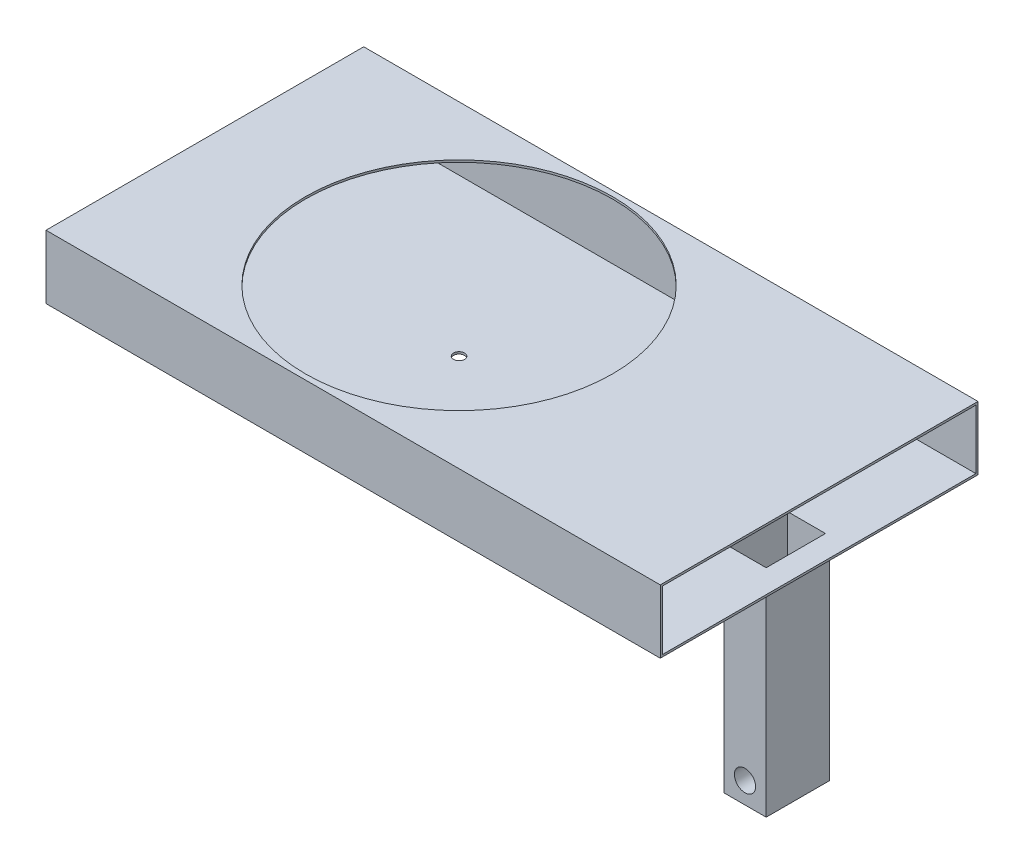
ISO-10303-21;
HEADER;
FILE_DESCRIPTION(('STEP AP214'),'2;1');
FILE_NAME('part.step','',(''),(''),'','','');
FILE_SCHEMA(('AUTOMOTIVE_DESIGN { 1 0 10303 214 1 1 1 1 }'));
ENDSEC;
DATA;
#1=APPLICATION_CONTEXT('core data for automotive mechanical design processes');
#2=APPLICATION_PROTOCOL_DEFINITION('international standard','automotive_design',2000,#1);
#3=PRODUCT_CONTEXT('',#1,'mechanical');
#4=PRODUCT('Part','Part','',(#3));
#5=PRODUCT_RELATED_PRODUCT_CATEGORY('part','',(#4));
#6=PRODUCT_DEFINITION_FORMATION('','',#4);
#7=PRODUCT_DEFINITION_CONTEXT('part definition',#1,'design');
#8=PRODUCT_DEFINITION('design','',#6,#7);
#9=PRODUCT_DEFINITION_SHAPE('','',#8);
#10=(LENGTH_UNIT() NAMED_UNIT(*) SI_UNIT(.MILLI.,.METRE.));
#11=(NAMED_UNIT(*) PLANE_ANGLE_UNIT() SI_UNIT($,.RADIAN.));
#12=(NAMED_UNIT(*) SI_UNIT($,.STERADIAN.) SOLID_ANGLE_UNIT());
#13=UNCERTAINTY_MEASURE_WITH_UNIT(LENGTH_MEASURE(1.E-05),#10,'distance_accuracy_value','');
#14=(GEOMETRIC_REPRESENTATION_CONTEXT(3) GLOBAL_UNCERTAINTY_ASSIGNED_CONTEXT((#13)) GLOBAL_UNIT_ASSIGNED_CONTEXT((#10,
#11,#12)) REPRESENTATION_CONTEXT('',''));
#15=CARTESIAN_POINT('',(0.,0.,0.));
#16=DIRECTION('',(0.,0.,1.));
#17=DIRECTION('',(1.,0.,0.));
#18=AXIS2_PLACEMENT_3D('',#15,#16,#17);
#19=CARTESIAN_POINT('',(368.3,76.2,-190.5));
#20=DIRECTION('',(-1.,0.,0.));
#21=DIRECTION('',(0.,0.,1.));
#22=AXIS2_PLACEMENT_3D('',#19,#20,#21);
#23=PLANE('',#22);
#24=DIRECTION('',(0.,0.,-1.));
#25=VECTOR('',#24,1.);
#26=CARTESIAN_POINT('',(368.3,0.,-190.5));
#27=LINE('',#26,#25);
#28=CARTESIAN_POINT('',(368.3,0.,190.5));
#29=VERTEX_POINT('',#28);
#30=CARTESIAN_POINT('',(368.3,0.,-190.5));
#31=VERTEX_POINT('',#30);
#32=EDGE_CURVE('E258',#29,#31,#27,.T.);
#33=ORIENTED_EDGE('',*,*,#32,.T.);
#34=DIRECTION('',(0.,-1.,0.));
#35=VECTOR('',#34,1.);
#36=CARTESIAN_POINT('',(368.3,76.2,-190.5));
#37=LINE('',#36,#35);
#38=CARTESIAN_POINT('',(368.3,76.2,-190.5));
#39=VERTEX_POINT('',#38);
#40=EDGE_CURVE('E11',#39,#31,#37,.T.);
#41=ORIENTED_EDGE('',*,*,#40,.F.);
#42=DIRECTION('',(0.,0.,-1.));
#43=VECTOR('',#42,1.);
#44=CARTESIAN_POINT('',(368.3,76.2,-190.5));
#45=LINE('',#44,#43);
#46=CARTESIAN_POINT('',(368.3,76.2,190.5));
#47=VERTEX_POINT('',#46);
#48=EDGE_CURVE('E259',#47,#39,#45,.T.);
#49=ORIENTED_EDGE('',*,*,#48,.F.);
#50=DIRECTION('',(0.,-1.,0.));
#51=VECTOR('',#50,1.);
#52=CARTESIAN_POINT('',(368.3,76.2,190.5));
#53=LINE('',#52,#51);
#54=EDGE_CURVE('E269',#47,#29,#53,.T.);
#55=ORIENTED_EDGE('',*,*,#54,.T.);
#56=EDGE_LOOP('',(#33,#41,#49,#55));
#57=FACE_BOUND('',#56,.T.);
#58=DIRECTION('',(0.,0.,-1.));
#59=VECTOR('',#58,1.);
#60=CARTESIAN_POINT('',(368.3,2.54,-190.5));
#61=LINE('',#60,#59);
#62=CARTESIAN_POINT('',(368.3,2.54,187.96));
#63=VERTEX_POINT('',#62);
#64=CARTESIAN_POINT('',(368.3,2.54,-187.96));
#65=VERTEX_POINT('',#64);
#66=EDGE_CURVE('E198',#63,#65,#61,.T.);
#67=ORIENTED_EDGE('',*,*,#66,.F.);
#68=DIRECTION('',(0.,-1.,0.));
#69=VECTOR('',#68,1.);
#70=CARTESIAN_POINT('',(368.3,76.2,187.96));
#71=LINE('',#70,#69);
#72=CARTESIAN_POINT('',(368.3,73.66,187.96));
#73=VERTEX_POINT('',#72);
#74=EDGE_CURVE('E210',#73,#63,#71,.T.);
#75=ORIENTED_EDGE('',*,*,#74,.F.);
#76=DIRECTION('',(0.,0.,-1.));
#77=VECTOR('',#76,1.);
#78=CARTESIAN_POINT('',(368.3,73.66,-190.5));
#79=LINE('',#78,#77);
#80=CARTESIAN_POINT('',(368.3,73.66,-187.96));
#81=VERTEX_POINT('',#80);
#82=EDGE_CURVE('E53',#73,#81,#79,.T.);
#83=ORIENTED_EDGE('',*,*,#82,.T.);
#84=DIRECTION('',(0.,-1.,0.));
#85=VECTOR('',#84,1.);
#86=CARTESIAN_POINT('',(368.3,76.2,-187.96));
#87=LINE('',#86,#85);
#88=EDGE_CURVE('E202',#81,#65,#87,.T.);
#89=ORIENTED_EDGE('',*,*,#88,.T.);
#90=EDGE_LOOP('',(#67,#75,#83,#89));
#91=FACE_BOUND('',#90,.T.);
#92=ADVANCED_FACE('F37',(#57,#91),#23,.F.);
#93=CARTESIAN_POINT('',(-368.3,76.2,-190.5));
#94=DIRECTION('',(1.,0.,0.));
#95=DIRECTION('',(0.,0.,-1.));
#96=AXIS2_PLACEMENT_3D('',#93,#94,#95);
#97=PLANE('',#96);
#98=DIRECTION('',(0.,0.,1.));
#99=VECTOR('',#98,1.);
#100=CARTESIAN_POINT('',(-368.3,0.,-190.5));
#101=LINE('',#100,#99);
#102=CARTESIAN_POINT('',(-368.3,0.,-190.5));
#103=VERTEX_POINT('',#102);
#104=CARTESIAN_POINT('',(-368.3,0.,190.5));
#105=VERTEX_POINT('',#104);
#106=EDGE_CURVE('E274',#103,#105,#101,.T.);
#107=ORIENTED_EDGE('',*,*,#106,.T.);
#108=DIRECTION('',(0.,-1.,0.));
#109=VECTOR('',#108,1.);
#110=CARTESIAN_POINT('',(-368.3,76.2,190.5));
#111=LINE('',#110,#109);
#112=CARTESIAN_POINT('',(-368.3,76.2,190.5));
#113=VERTEX_POINT('',#112);
#114=EDGE_CURVE('E279',#113,#105,#111,.T.);
#115=ORIENTED_EDGE('',*,*,#114,.F.);
#116=DIRECTION('',(0.,0.,1.));
#117=VECTOR('',#116,1.);
#118=CARTESIAN_POINT('',(-368.3,76.2,-190.5));
#119=LINE('',#118,#117);
#120=CARTESIAN_POINT('',(-368.3,76.2,-190.5));
#121=VERTEX_POINT('',#120);
#122=EDGE_CURVE('E265',#121,#113,#119,.T.);
#123=ORIENTED_EDGE('',*,*,#122,.F.);
#124=DIRECTION('',(0.,-1.,0.));
#125=VECTOR('',#124,1.);
#126=CARTESIAN_POINT('',(-368.3,76.2,-190.5));
#127=LINE('',#126,#125);
#128=EDGE_CURVE('E45',#121,#103,#127,.T.);
#129=ORIENTED_EDGE('',*,*,#128,.T.);
#130=EDGE_LOOP('',(#107,#115,#123,#129));
#131=FACE_BOUND('',#130,.T.);
#132=DIRECTION('',(0.,0.,1.));
#133=VECTOR('',#132,1.);
#134=CARTESIAN_POINT('',(-368.3,2.54,-190.5));
#135=LINE('',#134,#133);
#136=CARTESIAN_POINT('',(-368.3,2.54,-187.96));
#137=VERTEX_POINT('',#136);
#138=CARTESIAN_POINT('',(-368.3,2.54,187.96));
#139=VERTEX_POINT('',#138);
#140=EDGE_CURVE('E215',#137,#139,#135,.T.);
#141=ORIENTED_EDGE('',*,*,#140,.F.);
#142=DIRECTION('',(0.,-1.,0.));
#143=VECTOR('',#142,1.);
#144=CARTESIAN_POINT('',(-368.3,76.2,-187.96));
#145=LINE('',#144,#143);
#146=CARTESIAN_POINT('',(-368.3,73.66,-187.96));
#147=VERTEX_POINT('',#146);
#148=EDGE_CURVE('E206',#147,#137,#145,.T.);
#149=ORIENTED_EDGE('',*,*,#148,.F.);
#150=DIRECTION('',(0.,0.,1.));
#151=VECTOR('',#150,1.);
#152=CARTESIAN_POINT('',(-368.3,73.66,-190.5));
#153=LINE('',#152,#151);
#154=CARTESIAN_POINT('',(-368.3,73.66,187.96));
#155=VERTEX_POINT('',#154);
#156=EDGE_CURVE('E58',#147,#155,#153,.T.);
#157=ORIENTED_EDGE('',*,*,#156,.T.);
#158=DIRECTION('',(0.,-1.,0.));
#159=VECTOR('',#158,1.);
#160=CARTESIAN_POINT('',(-368.3,76.2,187.96));
#161=LINE('',#160,#159);
#162=EDGE_CURVE('E213',#155,#139,#161,.T.);
#163=ORIENTED_EDGE('',*,*,#162,.T.);
#164=EDGE_LOOP('',(#141,#149,#157,#163));
#165=FACE_BOUND('',#164,.T.);
#166=ADVANCED_FACE('F305',(#131,#165),#97,.F.);
#167=CARTESIAN_POINT('',(0.,0.,0.));
#168=DIRECTION('',(0.,1.,0.));
#169=DIRECTION('',(0.,0.,1.));
#170=AXIS2_PLACEMENT_3D('',#167,#168,#169);
#171=PLANE('',#170);
#172=CARTESIAN_POINT('',(-63.4999999999998,0.,0.));
#173=DIRECTION('',(0.,1.,0.));
#174=DIRECTION('',(0.,0.,1.));
#175=AXIS2_PLACEMENT_3D('',#172,#173,#174);
#176=CIRCLE('',#175,6.62140109862008);
#177=CARTESIAN_POINT('',(-63.4999999999998,0.,6.62140109862008));
#178=VERTEX_POINT('',#177);
#179=EDGE_CURVE('E334',#178,#178,#176,.T.);
#180=ORIENTED_EDGE('',*,*,#179,.T.);
#181=EDGE_LOOP('',(#180));
#182=FACE_BOUND('',#181,.T.);
#183=ORIENTED_EDGE('',*,*,#32,.F.);
#184=DIRECTION('',(1.,0.,0.));
#185=VECTOR('',#184,1.);
#186=CARTESIAN_POINT('',(-368.3,0.,190.5));
#187=LINE('',#186,#185);
#188=EDGE_CURVE('E263',#105,#29,#187,.T.);
#189=ORIENTED_EDGE('',*,*,#188,.F.);
#190=ORIENTED_EDGE('',*,*,#106,.F.);
#191=DIRECTION('',(-1.,0.,0.));
#192=VECTOR('',#191,1.);
#193=CARTESIAN_POINT('',(-368.3,0.,-190.5));
#194=LINE('',#193,#192);
#195=EDGE_CURVE('E272',#31,#103,#194,.T.);
#196=ORIENTED_EDGE('',*,*,#195,.F.);
#197=EDGE_LOOP('',(#183,#189,#190,#196));
#198=FACE_BOUND('',#197,.T.);
#199=DIRECTION('',(0.,0.,1.));
#200=VECTOR('',#199,1.);
#201=CARTESIAN_POINT('',(342.9,0.,38.1));
#202=LINE('',#201,#200);
#203=CARTESIAN_POINT('',(342.9,0.,-38.1));
#204=VERTEX_POINT('',#203);
#205=CARTESIAN_POINT('',(342.9,0.,38.1));
#206=VERTEX_POINT('',#205);
#207=EDGE_CURVE('E236',#204,#206,#202,.T.);
#208=ORIENTED_EDGE('',*,*,#207,.F.);
#209=DIRECTION('',(1.,0.,0.));
#210=VECTOR('',#209,1.);
#211=CARTESIAN_POINT('',(292.1,0.,-38.1));
#212=LINE('',#211,#210);
#213=CARTESIAN_POINT('',(292.1,0.,-38.1));
#214=VERTEX_POINT('',#213);
#215=EDGE_CURVE('E229',#214,#204,#212,.T.);
#216=ORIENTED_EDGE('',*,*,#215,.F.);
#217=DIRECTION('',(0.,0.,-1.));
#218=VECTOR('',#217,1.);
#219=CARTESIAN_POINT('',(292.1,0.,38.1));
#220=LINE('',#219,#218);
#221=CARTESIAN_POINT('',(292.1,0.,38.1));
#222=VERTEX_POINT('',#221);
#223=EDGE_CURVE('E242',#222,#214,#220,.T.);
#224=ORIENTED_EDGE('',*,*,#223,.F.);
#225=DIRECTION('',(-1.,0.,0.));
#226=VECTOR('',#225,1.);
#227=CARTESIAN_POINT('',(292.1,0.,38.1));
#228=LINE('',#227,#226);
#229=EDGE_CURVE('E239',#206,#222,#228,.T.);
#230=ORIENTED_EDGE('',*,*,#229,.F.);
#231=EDGE_LOOP('',(#208,#216,#224,#230));
#232=FACE_BOUND('',#231,.T.);
#233=ADVANCED_FACE('F310',(#182,#198,#232),#171,.F.);
#234=CARTESIAN_POINT('',(-368.3,76.2,-190.5));
#235=DIRECTION('',(0.,0.,1.));
#236=DIRECTION('',(1.,0.,0.));
#237=AXIS2_PLACEMENT_3D('',#234,#235,#236);
#238=PLANE('',#237);
#239=ORIENTED_EDGE('',*,*,#195,.T.);
#240=ORIENTED_EDGE('',*,*,#128,.F.);
#241=DIRECTION('',(-1.,0.,0.));
#242=VECTOR('',#241,1.);
#243=CARTESIAN_POINT('',(-368.3,76.2,-190.5));
#244=LINE('',#243,#242);
#245=EDGE_CURVE('E262',#39,#121,#244,.T.);
#246=ORIENTED_EDGE('',*,*,#245,.F.);
#247=ORIENTED_EDGE('',*,*,#40,.T.);
#248=EDGE_LOOP('',(#239,#240,#246,#247));
#249=FACE_BOUND('',#248,.T.);
#250=ADVANCED_FACE('F411',(#249),#238,.F.);
#251=CARTESIAN_POINT('',(-368.3,76.2,190.5));
#252=DIRECTION('',(0.,0.,-1.));
#253=DIRECTION('',(-1.,0.,0.));
#254=AXIS2_PLACEMENT_3D('',#251,#252,#253);
#255=PLANE('',#254);
#256=ORIENTED_EDGE('',*,*,#188,.T.);
#257=ORIENTED_EDGE('',*,*,#54,.F.);
#258=DIRECTION('',(1.,0.,0.));
#259=VECTOR('',#258,1.);
#260=CARTESIAN_POINT('',(-368.3,76.2,190.5));
#261=LINE('',#260,#259);
#262=EDGE_CURVE('E267',#113,#47,#261,.T.);
#263=ORIENTED_EDGE('',*,*,#262,.F.);
#264=ORIENTED_EDGE('',*,*,#114,.T.);
#265=EDGE_LOOP('',(#256,#257,#263,#264));
#266=FACE_BOUND('',#265,.T.);
#267=ADVANCED_FACE('F552',(#266),#255,.F.);
#268=CARTESIAN_POINT('',(0.,76.2,0.));
#269=DIRECTION('',(0.,1.,0.));
#270=DIRECTION('',(0.,0.,1.));
#271=AXIS2_PLACEMENT_3D('',#268,#269,#270);
#272=PLANE('',#271);
#273=CARTESIAN_POINT('',(-63.4999999999998,76.2,0.));
#274=DIRECTION('',(0.,1.,0.));
#275=DIRECTION('',(0.,0.,1.));
#276=AXIS2_PLACEMENT_3D('',#273,#274,#275);
#277=CIRCLE('',#276,184.15);
#278=CARTESIAN_POINT('',(-63.4999999999998,76.2,184.15));
#279=VERTEX_POINT('',#278);
#280=EDGE_CURVE('E331',#279,#279,#277,.T.);
#281=ORIENTED_EDGE('',*,*,#280,.F.);
#282=EDGE_LOOP('',(#281));
#283=FACE_BOUND('',#282,.T.);
#284=ORIENTED_EDGE('',*,*,#48,.T.);
#285=ORIENTED_EDGE('',*,*,#245,.T.);
#286=ORIENTED_EDGE('',*,*,#122,.T.);
#287=ORIENTED_EDGE('',*,*,#262,.T.);
#288=EDGE_LOOP('',(#284,#285,#286,#287));
#289=FACE_BOUND('',#288,.T.);
#290=ADVANCED_FACE('F537',(#283,#289),#272,.T.);
#291=CARTESIAN_POINT('',(342.9,-254.,38.1));
#292=DIRECTION('',(-1.,0.,0.));
#293=DIRECTION('',(0.,0.,1.));
#294=AXIS2_PLACEMENT_3D('',#291,#292,#293);
#295=PLANE('',#294);
#296=ORIENTED_EDGE('',*,*,#207,.T.);
#297=DIRECTION('',(0.,1.,0.));
#298=VECTOR('',#297,1.);
#299=CARTESIAN_POINT('',(342.9,-254.,38.1));
#300=LINE('',#299,#298);
#301=CARTESIAN_POINT('',(342.9,-254.,38.1));
#302=VERTEX_POINT('',#301);
#303=EDGE_CURVE('E255',#302,#206,#300,.T.);
#304=ORIENTED_EDGE('',*,*,#303,.F.);
#305=DIRECTION('',(0.,0.,1.));
#306=VECTOR('',#305,1.);
#307=CARTESIAN_POINT('',(342.9,-254.,38.1));
#308=LINE('',#307,#306);
#309=CARTESIAN_POINT('',(342.9,-254.,-38.1));
#310=VERTEX_POINT('',#309);
#311=EDGE_CURVE('E225',#310,#302,#308,.T.);
#312=ORIENTED_EDGE('',*,*,#311,.F.);
#313=DIRECTION('',(0.,1.,0.));
#314=VECTOR('',#313,1.);
#315=CARTESIAN_POINT('',(342.9,-254.,-38.1));
#316=LINE('',#315,#314);
#317=EDGE_CURVE('E235',#310,#204,#316,.T.);
#318=ORIENTED_EDGE('',*,*,#317,.T.);
#319=EDGE_LOOP('',(#296,#304,#312,#318));
#320=FACE_BOUND('',#319,.T.);
#321=ADVANCED_FACE('F528',(#320),#295,.F.);
#322=CARTESIAN_POINT('',(292.1,-254.,38.1));
#323=DIRECTION('',(0.,0.,-1.));
#324=DIRECTION('',(-1.,0.,0.));
#325=AXIS2_PLACEMENT_3D('',#322,#323,#324);
#326=PLANE('',#325);
#327=CARTESIAN_POINT('',(317.5,-228.6,38.0999999999999));
#328=DIRECTION('',(0.,0.,1.));
#329=DIRECTION('',(1.,0.,0.));
#330=AXIS2_PLACEMENT_3D('',#327,#328,#329);
#331=CIRCLE('',#330,12.7);
#332=CARTESIAN_POINT('',(330.2,-228.6,38.0999999999999));
#333=VERTEX_POINT('',#332);
#334=EDGE_CURVE('E205',#333,#333,#331,.T.);
#335=ORIENTED_EDGE('',*,*,#334,.F.);
#336=EDGE_LOOP('',(#335));
#337=FACE_BOUND('',#336,.T.);
#338=ORIENTED_EDGE('',*,*,#229,.T.);
#339=DIRECTION('',(0.,1.,0.));
#340=VECTOR('',#339,1.);
#341=CARTESIAN_POINT('',(292.1,-254.,38.1));
#342=LINE('',#341,#340);
#343=CARTESIAN_POINT('',(292.1,-254.,38.1));
#344=VERTEX_POINT('',#343);
#345=EDGE_CURVE('E252',#344,#222,#342,.T.);
#346=ORIENTED_EDGE('',*,*,#345,.F.);
#347=DIRECTION('',(-1.,0.,0.));
#348=VECTOR('',#347,1.);
#349=CARTESIAN_POINT('',(292.1,-254.,38.1));
#350=LINE('',#349,#348);
#351=EDGE_CURVE('E228',#302,#344,#350,.T.);
#352=ORIENTED_EDGE('',*,*,#351,.F.);
#353=ORIENTED_EDGE('',*,*,#303,.T.);
#354=EDGE_LOOP('',(#338,#346,#352,#353));
#355=FACE_BOUND('',#354,.T.);
#356=ADVANCED_FACE('F519',(#337,#355),#326,.F.);
#357=CARTESIAN_POINT('',(292.1,-254.,38.1));
#358=DIRECTION('',(1.,0.,0.));
#359=DIRECTION('',(0.,0.,-1.));
#360=AXIS2_PLACEMENT_3D('',#357,#358,#359);
#361=PLANE('',#360);
#362=ORIENTED_EDGE('',*,*,#223,.T.);
#363=DIRECTION('',(0.,1.,0.));
#364=VECTOR('',#363,1.);
#365=CARTESIAN_POINT('',(292.1,-254.,-38.1));
#366=LINE('',#365,#364);
#367=CARTESIAN_POINT('',(292.1,-254.,-38.1));
#368=VERTEX_POINT('',#367);
#369=EDGE_CURVE('E249',#368,#214,#366,.T.);
#370=ORIENTED_EDGE('',*,*,#369,.F.);
#371=DIRECTION('',(0.,0.,-1.));
#372=VECTOR('',#371,1.);
#373=CARTESIAN_POINT('',(292.1,-254.,38.1));
#374=LINE('',#373,#372);
#375=EDGE_CURVE('E231',#344,#368,#374,.T.);
#376=ORIENTED_EDGE('',*,*,#375,.F.);
#377=ORIENTED_EDGE('',*,*,#345,.T.);
#378=EDGE_LOOP('',(#362,#370,#376,#377));
#379=FACE_BOUND('',#378,.T.);
#380=ADVANCED_FACE('F510',(#379),#361,.F.);
#381=CARTESIAN_POINT('',(292.1,-254.,-38.1));
#382=DIRECTION('',(0.,0.,1.));
#383=DIRECTION('',(1.,0.,0.));
#384=AXIS2_PLACEMENT_3D('',#381,#382,#383);
#385=PLANE('',#384);
#386=CARTESIAN_POINT('',(317.5,-228.6,-38.1));
#387=DIRECTION('',(0.,0.,1.));
#388=DIRECTION('',(1.,0.,0.));
#389=AXIS2_PLACEMENT_3D('',#386,#387,#388);
#390=CIRCLE('',#389,12.7);
#391=CARTESIAN_POINT('',(330.2,-228.6,-38.1));
#392=VERTEX_POINT('',#391);
#393=EDGE_CURVE('E224',#392,#392,#390,.T.);
#394=ORIENTED_EDGE('',*,*,#393,.T.);
#395=EDGE_LOOP('',(#394));
#396=FACE_BOUND('',#395,.T.);
#397=ORIENTED_EDGE('',*,*,#215,.T.);
#398=ORIENTED_EDGE('',*,*,#317,.F.);
#399=DIRECTION('',(1.,0.,0.));
#400=VECTOR('',#399,1.);
#401=CARTESIAN_POINT('',(292.1,-254.,-38.1));
#402=LINE('',#401,#400);
#403=EDGE_CURVE('E233',#368,#310,#402,.T.);
#404=ORIENTED_EDGE('',*,*,#403,.F.);
#405=ORIENTED_EDGE('',*,*,#369,.T.);
#406=EDGE_LOOP('',(#397,#398,#404,#405));
#407=FACE_BOUND('',#406,.T.);
#408=ADVANCED_FACE('F286',(#396,#407),#385,.F.);
#409=CARTESIAN_POINT('',(0.,-254.,0.));
#410=DIRECTION('',(0.,-1.,0.));
#411=DIRECTION('',(0.,0.,-1.));
#412=AXIS2_PLACEMENT_3D('',#409,#410,#411);
#413=PLANE('',#412);
#414=ORIENTED_EDGE('',*,*,#311,.T.);
#415=ORIENTED_EDGE('',*,*,#351,.T.);
#416=ORIENTED_EDGE('',*,*,#375,.T.);
#417=ORIENTED_EDGE('',*,*,#403,.T.);
#418=EDGE_LOOP('',(#414,#415,#416,#417));
#419=FACE_BOUND('',#418,.T.);
#420=ADVANCED_FACE('F291',(#419),#413,.T.);
#421=CARTESIAN_POINT('',(317.5,-228.6,-190.5));
#422=DIRECTION('',(0.,0.,1.));
#423=DIRECTION('',(1.,0.,0.));
#424=AXIS2_PLACEMENT_3D('',#421,#422,#423);
#425=CYLINDRICAL_SURFACE('',#424,12.7);
#426=CARTESIAN_POINT('',(330.2,-228.6,38.0999999999999));
#427=CARTESIAN_POINT('',(330.2,-228.6,37.3062499999999));
#428=CARTESIAN_POINT('',(330.2,-228.6,36.5124999999999));
#429=CARTESIAN_POINT('',(330.2,-228.6,34.9249999999999));
#430=CARTESIAN_POINT('',(330.2,-228.6,34.1312499999999));
#431=CARTESIAN_POINT('',(330.2,-228.6,32.5437499999999));
#432=CARTESIAN_POINT('',(330.2,-228.6,31.7499999999999));
#433=CARTESIAN_POINT('',(330.2,-228.6,30.1624999999999));
#434=CARTESIAN_POINT('',(330.2,-228.6,29.3687499999999));
#435=CARTESIAN_POINT('',(330.2,-228.6,27.7812499999999));
#436=CARTESIAN_POINT('',(330.2,-228.6,26.9874999999999));
#437=CARTESIAN_POINT('',(330.2,-228.6,25.3999999999999));
#438=CARTESIAN_POINT('',(330.2,-228.6,24.6062499999999));
#439=CARTESIAN_POINT('',(330.2,-228.6,23.0187499999999));
#440=CARTESIAN_POINT('',(330.2,-228.6,22.2249999999999));
#441=CARTESIAN_POINT('',(330.2,-228.6,20.6374999999999));
#442=CARTESIAN_POINT('',(330.2,-228.6,19.8437499999999));
#443=CARTESIAN_POINT('',(330.2,-228.6,18.2562499999999));
#444=CARTESIAN_POINT('',(330.2,-228.6,17.4624999999999));
#445=CARTESIAN_POINT('',(330.2,-228.6,15.8749999999999));
#446=CARTESIAN_POINT('',(330.2,-228.6,15.0812499999999));
#447=CARTESIAN_POINT('',(330.2,-228.6,13.4937499999999));
#448=CARTESIAN_POINT('',(330.2,-228.6,12.6999999999999));
#449=CARTESIAN_POINT('',(330.2,-228.6,11.1124999999999));
#450=CARTESIAN_POINT('',(330.2,-228.6,10.3187499999999));
#451=CARTESIAN_POINT('',(330.2,-228.6,8.73124999999995));
#452=CARTESIAN_POINT('',(330.2,-228.6,7.93749999999995));
#453=CARTESIAN_POINT('',(330.2,-228.6,6.34999999999995));
#454=CARTESIAN_POINT('',(330.2,-228.6,5.55624999999995));
#455=CARTESIAN_POINT('',(330.2,-228.6,3.96874999999995));
#456=CARTESIAN_POINT('',(330.2,-228.6,3.17499999999995));
#457=CARTESIAN_POINT('',(330.2,-228.6,1.58749999999995));
#458=CARTESIAN_POINT('',(330.2,-228.6,0.793749999999945));
#459=CARTESIAN_POINT('',(330.2,-228.6,-0.793750000000056));
#460=CARTESIAN_POINT('',(330.2,-228.6,-1.58750000000006));
#461=CARTESIAN_POINT('',(330.2,-228.6,-3.17500000000006));
#462=CARTESIAN_POINT('',(330.2,-228.6,-3.96875000000006));
#463=CARTESIAN_POINT('',(330.2,-228.6,-5.55625000000006));
#464=CARTESIAN_POINT('',(330.2,-228.6,-6.35000000000006));
#465=CARTESIAN_POINT('',(330.2,-228.6,-7.93750000000006));
#466=CARTESIAN_POINT('',(330.2,-228.6,-8.73125000000006));
#467=CARTESIAN_POINT('',(330.2,-228.6,-10.3187500000001));
#468=CARTESIAN_POINT('',(330.2,-228.6,-11.1125000000001));
#469=CARTESIAN_POINT('',(330.2,-228.6,-12.7000000000001));
#470=CARTESIAN_POINT('',(330.2,-228.6,-13.49375));
#471=CARTESIAN_POINT('',(330.2,-228.6,-15.08125));
#472=CARTESIAN_POINT('',(330.2,-228.6,-15.875));
#473=CARTESIAN_POINT('',(330.2,-228.6,-17.4625));
#474=CARTESIAN_POINT('',(330.2,-228.6,-18.25625));
#475=CARTESIAN_POINT('',(330.2,-228.6,-19.84375));
#476=CARTESIAN_POINT('',(330.2,-228.6,-20.6375));
#477=CARTESIAN_POINT('',(330.2,-228.6,-22.225));
#478=CARTESIAN_POINT('',(330.2,-228.6,-23.01875));
#479=CARTESIAN_POINT('',(330.2,-228.6,-24.60625));
#480=CARTESIAN_POINT('',(330.2,-228.6,-25.4));
#481=CARTESIAN_POINT('',(330.2,-228.6,-26.9875));
#482=CARTESIAN_POINT('',(330.2,-228.6,-27.78125));
#483=CARTESIAN_POINT('',(330.2,-228.6,-29.36875));
#484=CARTESIAN_POINT('',(330.2,-228.6,-30.1625));
#485=CARTESIAN_POINT('',(330.2,-228.6,-31.75));
#486=CARTESIAN_POINT('',(330.2,-228.6,-32.54375));
#487=CARTESIAN_POINT('',(330.2,-228.6,-34.13125));
#488=CARTESIAN_POINT('',(330.2,-228.6,-34.925));
#489=CARTESIAN_POINT('',(330.2,-228.6,-36.5125));
#490=CARTESIAN_POINT('',(330.2,-228.6,-37.30625));
#491=CARTESIAN_POINT('',(330.2,-228.6,-38.1));
#492=B_SPLINE_CURVE_WITH_KNOTS('',3,(#426,#427,#428,#429,#430,#431,#432,#433,#434,#435,#436,
#437,#438,#439,#440,#441,#442,#443,#444,#445,#446,#447,#448,#449,#450,#451,#452,#453,#454,#455,
#456,#457,#458,#459,#460,#461,#462,#463,#464,#465,#466,#467,#468,#469,#470,#471,#472,#473,#474,
#475,#476,#477,#478,#479,#480,#481,#482,#483,#484,#485,#486,#487,#488,#489,#490,#491),
.UNSPECIFIED.,.F.,.F.,(4,2,2,2,2,2,2,2,2,2,2,2,2,2,2,2,2,2,2,2,2,2,2,2,2,2,2,2,2,2,2,2,4),(0.,
2.38125,4.7625,7.14375,9.52500000000001,11.90625,14.2875,16.66875,19.05,21.43125,23.8125,
26.19375,28.575,30.95625,33.3375,35.71875,38.1,40.48125,42.8625,45.24375,47.625,50.00625,
52.3874999999999,54.7687499999999,57.1499999999999,59.53125,61.9125,64.2937499999999,
66.6749999999999,69.0562499999999,71.4374999999999,73.8187499999999,76.1999999999999),.UNSPECIFIED.);
#493=EDGE_CURVE('BSEAM289',#333,#392,#492,.T.);
#494=ORIENTED_EDGE('',*,*,#334,.T.);
#495=ORIENTED_EDGE('',*,*,#393,.F.);
#496=ORIENTED_EDGE('',*,*,#493,.T.);
#497=ORIENTED_EDGE('',*,*,#493,.F.);
#498=EDGE_LOOP('',(#494,#496,#495,#497));
#499=FACE_BOUND('',#498,.T.);
#500=ADVANCED_FACE('F289',(#499),#425,.F.);
#501=CARTESIAN_POINT('',(0.,2.54,0.));
#502=DIRECTION('',(0.,1.,0.));
#503=DIRECTION('',(0.,0.,1.));
#504=AXIS2_PLACEMENT_3D('',#501,#502,#503);
#505=PLANE('',#504);
#506=CARTESIAN_POINT('',(-63.4999999999998,2.53999999999999,0.));
#507=DIRECTION('',(0.,1.,0.));
#508=DIRECTION('',(0.,0.,1.));
#509=AXIS2_PLACEMENT_3D('',#506,#507,#508);
#510=CIRCLE('',#509,6.62140109862008);
#511=CARTESIAN_POINT('',(-63.4999999999998,2.53999999999976,6.62140109862008));
#512=VERTEX_POINT('',#511);
#513=EDGE_CURVE('E40',#512,#512,#510,.T.);
#514=ORIENTED_EDGE('',*,*,#513,.F.);
#515=EDGE_LOOP('',(#514));
#516=FACE_BOUND('',#515,.T.);
#517=ORIENTED_EDGE('',*,*,#66,.T.);
#518=DIRECTION('',(-1.,0.,0.));
#519=VECTOR('',#518,1.);
#520=CARTESIAN_POINT('',(-368.3,2.54,-187.96));
#521=LINE('',#520,#519);
#522=EDGE_CURVE('E201',#65,#137,#521,.T.);
#523=ORIENTED_EDGE('',*,*,#522,.T.);
#524=ORIENTED_EDGE('',*,*,#140,.T.);
#525=DIRECTION('',(1.,0.,0.));
#526=VECTOR('',#525,1.);
#527=CARTESIAN_POINT('',(-368.3,2.54,187.96));
#528=LINE('',#527,#526);
#529=EDGE_CURVE('E209',#139,#63,#528,.T.);
#530=ORIENTED_EDGE('',*,*,#529,.T.);
#531=EDGE_LOOP('',(#517,#523,#524,#530));
#532=FACE_BOUND('',#531,.T.);
#533=DIRECTION('',(0.,0.,1.));
#534=VECTOR('',#533,1.);
#535=CARTESIAN_POINT('',(340.36,2.54,0.));
#536=LINE('',#535,#534);
#537=CARTESIAN_POINT('',(340.36,2.54,-35.56));
#538=VERTEX_POINT('',#537);
#539=CARTESIAN_POINT('',(340.36,2.54,35.56));
#540=VERTEX_POINT('',#539);
#541=EDGE_CURVE('E152',#538,#540,#536,.T.);
#542=ORIENTED_EDGE('',*,*,#541,.T.);
#543=DIRECTION('',(-1.,0.,0.));
#544=VECTOR('',#543,1.);
#545=CARTESIAN_POINT('',(0.,2.54,35.5599999999999));
#546=LINE('',#545,#544);
#547=CARTESIAN_POINT('',(294.64,2.54,35.56));
#548=VERTEX_POINT('',#547);
#549=EDGE_CURVE('E163',#540,#548,#546,.T.);
#550=ORIENTED_EDGE('',*,*,#549,.T.);
#551=DIRECTION('',(0.,0.,-1.));
#552=VECTOR('',#551,1.);
#553=CARTESIAN_POINT('',(294.64,2.54,0.));
#554=LINE('',#553,#552);
#555=CARTESIAN_POINT('',(294.64,2.54,-35.56));
#556=VERTEX_POINT('',#555);
#557=EDGE_CURVE('E169',#548,#556,#554,.T.);
#558=ORIENTED_EDGE('',*,*,#557,.T.);
#559=DIRECTION('',(1.,0.,0.));
#560=VECTOR('',#559,1.);
#561=CARTESIAN_POINT('',(0.,2.54,-35.56));
#562=LINE('',#561,#560);
#563=EDGE_CURVE('E167',#556,#538,#562,.T.);
#564=ORIENTED_EDGE('',*,*,#563,.T.);
#565=EDGE_LOOP('',(#542,#550,#558,#564));
#566=FACE_BOUND('',#565,.T.);
#567=ADVANCED_FACE('F168',(#516,#532,#566),#505,.T.);
#568=CARTESIAN_POINT('',(-368.3,76.2,-187.96));
#569=DIRECTION('',(0.,0.,1.));
#570=DIRECTION('',(1.,0.,0.));
#571=AXIS2_PLACEMENT_3D('',#568,#569,#570);
#572=PLANE('',#571);
#573=ORIENTED_EDGE('',*,*,#522,.F.);
#574=ORIENTED_EDGE('',*,*,#88,.F.);
#575=DIRECTION('',(-1.,0.,0.));
#576=VECTOR('',#575,1.);
#577=CARTESIAN_POINT('',(-368.3,73.66,-187.96));
#578=LINE('',#577,#576);
#579=EDGE_CURVE('E208',#81,#147,#578,.T.);
#580=ORIENTED_EDGE('',*,*,#579,.T.);
#581=ORIENTED_EDGE('',*,*,#148,.T.);
#582=EDGE_LOOP('',(#573,#574,#580,#581));
#583=FACE_BOUND('',#582,.T.);
#584=ADVANCED_FACE('F298',(#583),#572,.T.);
#585=CARTESIAN_POINT('',(-368.3,76.2,187.96));
#586=DIRECTION('',(0.,0.,-1.));
#587=DIRECTION('',(-1.,0.,0.));
#588=AXIS2_PLACEMENT_3D('',#585,#586,#587);
#589=PLANE('',#588);
#590=ORIENTED_EDGE('',*,*,#529,.F.);
#591=ORIENTED_EDGE('',*,*,#162,.F.);
#592=DIRECTION('',(1.,0.,0.));
#593=VECTOR('',#592,1.);
#594=CARTESIAN_POINT('',(-368.3,73.66,187.96));
#595=LINE('',#594,#593);
#596=EDGE_CURVE('E214',#155,#73,#595,.T.);
#597=ORIENTED_EDGE('',*,*,#596,.T.);
#598=ORIENTED_EDGE('',*,*,#74,.T.);
#599=EDGE_LOOP('',(#590,#591,#597,#598));
#600=FACE_BOUND('',#599,.T.);
#601=ADVANCED_FACE('F324',(#600),#589,.T.);
#602=CARTESIAN_POINT('',(0.,73.66,0.));
#603=DIRECTION('',(0.,1.,0.));
#604=DIRECTION('',(0.,0.,1.));
#605=AXIS2_PLACEMENT_3D('',#602,#603,#604);
#606=PLANE('',#605);
#607=CARTESIAN_POINT('',(-63.4999999999998,73.66,0.));
#608=DIRECTION('',(0.,1.,0.));
#609=DIRECTION('',(0.,0.,1.));
#610=AXIS2_PLACEMENT_3D('',#607,#608,#609);
#611=CIRCLE('',#610,184.15);
#612=CARTESIAN_POINT('',(-63.4999999999998,73.66,184.15));
#613=VERTEX_POINT('',#612);
#614=EDGE_CURVE('E190',#613,#613,#611,.T.);
#615=ORIENTED_EDGE('',*,*,#614,.T.);
#616=EDGE_LOOP('',(#615));
#617=FACE_BOUND('',#616,.T.);
#618=ORIENTED_EDGE('',*,*,#82,.F.);
#619=ORIENTED_EDGE('',*,*,#596,.F.);
#620=ORIENTED_EDGE('',*,*,#156,.F.);
#621=ORIENTED_EDGE('',*,*,#579,.F.);
#622=EDGE_LOOP('',(#618,#619,#620,#621));
#623=FACE_BOUND('',#622,.T.);
#624=ADVANCED_FACE('F360',(#617,#623),#606,.F.);
#625=CARTESIAN_POINT('',(340.36,-254.,38.1));
#626=DIRECTION('',(-1.,0.,0.));
#627=DIRECTION('',(0.,0.,1.));
#628=AXIS2_PLACEMENT_3D('',#625,#626,#627);
#629=PLANE('',#628);
#630=ORIENTED_EDGE('',*,*,#541,.F.);
#631=DIRECTION('',(0.,1.,0.));
#632=VECTOR('',#631,1.);
#633=CARTESIAN_POINT('',(340.36,-254.,-35.56));
#634=LINE('',#633,#632);
#635=CARTESIAN_POINT('',(340.36,-251.46,-35.56));
#636=VERTEX_POINT('',#635);
#637=EDGE_CURVE('E157',#636,#538,#634,.T.);
#638=ORIENTED_EDGE('',*,*,#637,.F.);
#639=DIRECTION('',(0.,0.,1.));
#640=VECTOR('',#639,1.);
#641=CARTESIAN_POINT('',(340.36,-251.46,38.1));
#642=LINE('',#641,#640);
#643=CARTESIAN_POINT('',(340.36,-251.46,35.56));
#644=VERTEX_POINT('',#643);
#645=EDGE_CURVE('E173',#636,#644,#642,.T.);
#646=ORIENTED_EDGE('',*,*,#645,.T.);
#647=DIRECTION('',(0.,1.,0.));
#648=VECTOR('',#647,1.);
#649=CARTESIAN_POINT('',(340.36,-254.,35.56));
#650=LINE('',#649,#648);
#651=EDGE_CURVE('E160',#644,#540,#650,.T.);
#652=ORIENTED_EDGE('',*,*,#651,.T.);
#653=EDGE_LOOP('',(#630,#638,#646,#652));
#654=FACE_BOUND('',#653,.T.);
#655=ADVANCED_FACE('F154',(#654),#629,.T.);
#656=CARTESIAN_POINT('',(292.1,-254.,35.56));
#657=DIRECTION('',(0.,0.,-1.));
#658=DIRECTION('',(-1.,0.,0.));
#659=AXIS2_PLACEMENT_3D('',#656,#657,#658);
#660=PLANE('',#659);
#661=CARTESIAN_POINT('',(317.5,-228.6,35.56));
#662=DIRECTION('',(0.,0.,-1.));
#663=DIRECTION('',(-1.,0.,0.));
#664=AXIS2_PLACEMENT_3D('',#661,#662,#663);
#665=CIRCLE('',#664,15.24);
#666=CARTESIAN_POINT('',(332.74,-228.6,35.56));
#667=VERTEX_POINT('',#666);
#668=EDGE_CURVE('E187',#667,#667,#665,.F.);
#669=ORIENTED_EDGE('',*,*,#668,.T.);
#670=EDGE_LOOP('',(#669));
#671=FACE_BOUND('',#670,.T.);
#672=ORIENTED_EDGE('',*,*,#549,.F.);
#673=ORIENTED_EDGE('',*,*,#651,.F.);
#674=DIRECTION('',(-1.,0.,0.));
#675=VECTOR('',#674,1.);
#676=CARTESIAN_POINT('',(292.1,-251.46,35.56));
#677=LINE('',#676,#675);
#678=CARTESIAN_POINT('',(294.64,-251.46,35.56));
#679=VERTEX_POINT('',#678);
#680=EDGE_CURVE('E193',#644,#679,#677,.T.);
#681=ORIENTED_EDGE('',*,*,#680,.T.);
#682=DIRECTION('',(0.,1.,0.));
#683=VECTOR('',#682,1.);
#684=CARTESIAN_POINT('',(294.64,-254.,35.56));
#685=LINE('',#684,#683);
#686=EDGE_CURVE('E180',#679,#548,#685,.T.);
#687=ORIENTED_EDGE('',*,*,#686,.T.);
#688=EDGE_LOOP('',(#672,#673,#681,#687));
#689=FACE_BOUND('',#688,.T.);
#690=ADVANCED_FACE('F366',(#671,#689),#660,.T.);
#691=CARTESIAN_POINT('',(294.64,-254.,38.1));
#692=DIRECTION('',(1.,0.,0.));
#693=DIRECTION('',(0.,0.,-1.));
#694=AXIS2_PLACEMENT_3D('',#691,#692,#693);
#695=PLANE('',#694);
#696=ORIENTED_EDGE('',*,*,#557,.F.);
#697=ORIENTED_EDGE('',*,*,#686,.F.);
#698=DIRECTION('',(0.,0.,-1.));
#699=VECTOR('',#698,1.);
#700=CARTESIAN_POINT('',(294.64,-251.46,38.1));
#701=LINE('',#700,#699);
#702=CARTESIAN_POINT('',(294.64,-251.46,-35.56));
#703=VERTEX_POINT('',#702);
#704=EDGE_CURVE('E182',#679,#703,#701,.T.);
#705=ORIENTED_EDGE('',*,*,#704,.T.);
#706=DIRECTION('',(0.,1.,0.));
#707=VECTOR('',#706,1.);
#708=CARTESIAN_POINT('',(294.64,-254.,-35.56));
#709=LINE('',#708,#707);
#710=EDGE_CURVE('E178',#703,#556,#709,.T.);
#711=ORIENTED_EDGE('',*,*,#710,.T.);
#712=EDGE_LOOP('',(#696,#697,#705,#711));
#713=FACE_BOUND('',#712,.T.);
#714=ADVANCED_FACE('F369',(#713),#695,.T.);
#715=CARTESIAN_POINT('',(292.1,-254.,-35.56));
#716=DIRECTION('',(0.,0.,1.));
#717=DIRECTION('',(1.,0.,0.));
#718=AXIS2_PLACEMENT_3D('',#715,#716,#717);
#719=PLANE('',#718);
#720=CARTESIAN_POINT('',(317.5,-228.6,-35.56));
#721=DIRECTION('',(0.,0.,1.));
#722=DIRECTION('',(1.,0.,0.));
#723=AXIS2_PLACEMENT_3D('',#720,#721,#722);
#724=CIRCLE('',#723,15.24);
#725=CARTESIAN_POINT('',(332.74,-228.6,-35.56));
#726=VERTEX_POINT('',#725);
#727=EDGE_CURVE('E164',#726,#726,#724,.T.);
#728=ORIENTED_EDGE('',*,*,#727,.F.);
#729=EDGE_LOOP('',(#728));
#730=FACE_BOUND('',#729,.T.);
#731=ORIENTED_EDGE('',*,*,#563,.F.);
#732=ORIENTED_EDGE('',*,*,#710,.F.);
#733=DIRECTION('',(1.,0.,0.));
#734=VECTOR('',#733,1.);
#735=CARTESIAN_POINT('',(292.1,-251.46,-35.56));
#736=LINE('',#735,#734);
#737=EDGE_CURVE('E177',#703,#636,#736,.T.);
#738=ORIENTED_EDGE('',*,*,#737,.T.);
#739=ORIENTED_EDGE('',*,*,#637,.T.);
#740=EDGE_LOOP('',(#731,#732,#738,#739));
#741=FACE_BOUND('',#740,.T.);
#742=ADVANCED_FACE('F175',(#730,#741),#719,.T.);
#743=CARTESIAN_POINT('',(0.,-251.46,0.));
#744=DIRECTION('',(0.,-1.,0.));
#745=DIRECTION('',(0.,0.,-1.));
#746=AXIS2_PLACEMENT_3D('',#743,#744,#745);
#747=PLANE('',#746);
#748=ORIENTED_EDGE('',*,*,#645,.F.);
#749=ORIENTED_EDGE('',*,*,#737,.F.);
#750=ORIENTED_EDGE('',*,*,#704,.F.);
#751=ORIENTED_EDGE('',*,*,#680,.F.);
#752=EDGE_LOOP('',(#748,#749,#750,#751));
#753=FACE_BOUND('',#752,.T.);
#754=ADVANCED_FACE('F376',(#753),#747,.F.);
#755=CARTESIAN_POINT('',(317.5,-228.6,-190.5));
#756=DIRECTION('',(0.,0.,1.));
#757=DIRECTION('',(1.,0.,0.));
#758=AXIS2_PLACEMENT_3D('',#755,#756,#757);
#759=CYLINDRICAL_SURFACE('',#758,15.24);
#760=CARTESIAN_POINT('',(332.74,-228.6,35.56));
#761=CARTESIAN_POINT('',(332.74,-228.6,34.8191666666667));
#762=CARTESIAN_POINT('',(332.74,-228.6,34.0783333333333));
#763=CARTESIAN_POINT('',(332.74,-228.6,32.5966666666667));
#764=CARTESIAN_POINT('',(332.74,-228.6,31.8558333333333));
#765=CARTESIAN_POINT('',(332.74,-228.6,30.3741666666666));
#766=CARTESIAN_POINT('',(332.74,-228.6,29.6333333333333));
#767=CARTESIAN_POINT('',(332.74,-228.6,28.1516666666666));
#768=CARTESIAN_POINT('',(332.74,-228.6,27.4108333333333));
#769=CARTESIAN_POINT('',(332.74,-228.6,25.9291666666666));
#770=CARTESIAN_POINT('',(332.74,-228.6,25.1883333333333));
#771=CARTESIAN_POINT('',(332.74,-228.6,23.7066666666666));
#772=CARTESIAN_POINT('',(332.74,-228.6,22.9658333333333));
#773=CARTESIAN_POINT('',(332.74,-228.6,21.4841666666666));
#774=CARTESIAN_POINT('',(332.74,-228.6,20.7433333333333));
#775=CARTESIAN_POINT('',(332.74,-228.6,19.2616666666666));
#776=CARTESIAN_POINT('',(332.74,-228.6,18.5208333333333));
#777=CARTESIAN_POINT('',(332.74,-228.6,17.0391666666666));
#778=CARTESIAN_POINT('',(332.74,-228.6,16.2983333333333));
#779=CARTESIAN_POINT('',(332.74,-228.6,14.8166666666666));
#780=CARTESIAN_POINT('',(332.74,-228.6,14.0758333333333));
#781=CARTESIAN_POINT('',(332.74,-228.6,12.5941666666666));
#782=CARTESIAN_POINT('',(332.74,-228.6,11.8533333333333));
#783=CARTESIAN_POINT('',(332.74,-228.6,10.3716666666666));
#784=CARTESIAN_POINT('',(332.74,-228.6,9.63083333333331));
#785=CARTESIAN_POINT('',(332.74,-228.6,8.14916666666664));
#786=CARTESIAN_POINT('',(332.74,-228.6,7.4083333333333));
#787=CARTESIAN_POINT('',(332.74,-228.6,5.92666666666664));
#788=CARTESIAN_POINT('',(332.74,-228.6,5.18583333333331));
#789=CARTESIAN_POINT('',(332.74,-228.6,3.70416666666664));
#790=CARTESIAN_POINT('',(332.74,-228.6,2.9633333333333));
#791=CARTESIAN_POINT('',(332.74,-228.6,1.48166666666663));
#792=CARTESIAN_POINT('',(332.74,-228.6,0.740833333333302));
#793=CARTESIAN_POINT('',(332.74,-228.6,-0.740833333333357));
#794=CARTESIAN_POINT('',(332.74,-228.6,-1.48166666666669));
#795=CARTESIAN_POINT('',(332.74,-228.6,-2.96333333333335));
#796=CARTESIAN_POINT('',(332.74,-228.6,-3.70416666666669));
#797=CARTESIAN_POINT('',(332.74,-228.6,-5.18583333333336));
#798=CARTESIAN_POINT('',(332.74,-228.6,-5.92666666666669));
#799=CARTESIAN_POINT('',(332.74,-228.6,-7.40833333333336));
#800=CARTESIAN_POINT('',(332.74,-228.6,-8.1491666666667));
#801=CARTESIAN_POINT('',(332.74,-228.6,-9.63083333333337));
#802=CARTESIAN_POINT('',(332.74,-228.6,-10.3716666666667));
#803=CARTESIAN_POINT('',(332.74,-228.6,-11.8533333333334));
#804=CARTESIAN_POINT('',(332.74,-228.6,-12.5941666666667));
#805=CARTESIAN_POINT('',(332.74,-228.6,-14.0758333333334));
#806=CARTESIAN_POINT('',(332.74,-228.6,-14.8166666666667));
#807=CARTESIAN_POINT('',(332.74,-228.6,-16.2983333333334));
#808=CARTESIAN_POINT('',(332.74,-228.6,-17.0391666666667));
#809=CARTESIAN_POINT('',(332.74,-228.6,-18.5208333333334));
#810=CARTESIAN_POINT('',(332.74,-228.6,-19.2616666666667));
#811=CARTESIAN_POINT('',(332.74,-228.6,-20.7433333333334));
#812=CARTESIAN_POINT('',(332.74,-228.6,-21.4841666666667));
#813=CARTESIAN_POINT('',(332.74,-228.6,-22.9658333333334));
#814=CARTESIAN_POINT('',(332.74,-228.6,-23.7066666666667));
#815=CARTESIAN_POINT('',(332.74,-228.6,-25.1883333333334));
#816=CARTESIAN_POINT('',(332.74,-228.6,-25.9291666666667));
#817=CARTESIAN_POINT('',(332.74,-228.6,-27.4108333333334));
#818=CARTESIAN_POINT('',(332.74,-228.6,-28.1516666666667));
#819=CARTESIAN_POINT('',(332.74,-228.6,-29.6333333333334));
#820=CARTESIAN_POINT('',(332.74,-228.6,-30.3741666666667));
#821=CARTESIAN_POINT('',(332.74,-228.6,-31.8558333333334));
#822=CARTESIAN_POINT('',(332.74,-228.6,-32.5966666666667));
#823=CARTESIAN_POINT('',(332.74,-228.6,-34.0783333333334));
#824=CARTESIAN_POINT('',(332.74,-228.6,-34.8191666666667));
#825=CARTESIAN_POINT('',(332.74,-228.6,-35.56));
#826=B_SPLINE_CURVE_WITH_KNOTS('',3,(#760,#761,#762,#763,#764,#765,#766,#767,#768,#769,#770,
#771,#772,#773,#774,#775,#776,#777,#778,#779,#780,#781,#782,#783,#784,#785,#786,#787,#788,#789,
#790,#791,#792,#793,#794,#795,#796,#797,#798,#799,#800,#801,#802,#803,#804,#805,#806,#807,#808,
#809,#810,#811,#812,#813,#814,#815,#816,#817,#818,#819,#820,#821,#822,#823,#824,#825),
.UNSPECIFIED.,.F.,.F.,(4,2,2,2,2,2,2,2,2,2,2,2,2,2,2,2,2,2,2,2,2,2,2,2,2,2,2,2,2,2,2,2,4),(0.,
2.22249999999999,4.445,6.66749999999999,8.89000000000001,11.1125,13.335,15.5575,17.78,20.0025,
22.225,24.4475,26.67,28.8925,31.115,33.3375,35.56,37.7825,40.005,42.2275,44.45,46.6725,48.895,
51.1175,53.34,55.5625,57.785,60.0075,62.23,64.4525,66.675,68.8975,71.12),.UNSPECIFIED.);
#827=EDGE_CURVE('BSEAM351',#667,#726,#826,.T.);
#828=ORIENTED_EDGE('',*,*,#668,.F.);
#829=ORIENTED_EDGE('',*,*,#727,.T.);
#830=ORIENTED_EDGE('',*,*,#827,.T.);
#831=ORIENTED_EDGE('',*,*,#827,.F.);
#832=EDGE_LOOP('',(#828,#830,#829,#831));
#833=FACE_BOUND('',#832,.T.);
#834=ADVANCED_FACE('F351',(#833),#759,.T.);
#835=CARTESIAN_POINT('',(-63.4999999999998,73.66,0.));
#836=DIRECTION('',(0.,1.,0.));
#837=DIRECTION('',(0.,0.,1.));
#838=AXIS2_PLACEMENT_3D('',#835,#836,#837);
#839=CYLINDRICAL_SURFACE('',#838,184.15);
#840=ORIENTED_EDGE('',*,*,#614,.F.);
#841=EDGE_LOOP('',(#840));
#842=FACE_BOUND('',#841,.T.);
#843=ORIENTED_EDGE('',*,*,#280,.T.);
#844=EDGE_LOOP('',(#843));
#845=FACE_BOUND('',#844,.T.);
#846=ADVANCED_FACE('F346',(#842,#845),#839,.F.);
#847=CARTESIAN_POINT('',(-63.4999999999998,-1143.,0.));
#848=DIRECTION('',(0.,1.,0.));
#849=DIRECTION('',(0.,0.,1.));
#850=AXIS2_PLACEMENT_3D('',#847,#848,#849);
#851=CYLINDRICAL_SURFACE('',#850,6.62140109862008);
#852=CARTESIAN_POINT('',(-63.4999999999998,2.53999999999976,6.62140109862008));
#853=CARTESIAN_POINT('',(-63.4999999999998,2.51354166666647,6.62140109862008));
#854=CARTESIAN_POINT('',(-63.4999999999998,2.48708333333318,6.62140109862008));
#855=CARTESIAN_POINT('',(-63.4999999999998,2.43416666666652,6.62140109862008));
#856=CARTESIAN_POINT('',(-63.4999999999998,2.40770833333315,6.62140109862008));
#857=CARTESIAN_POINT('',(-63.4999999999998,2.35479166666641,6.62140109862008));
#858=CARTESIAN_POINT('',(-63.4999999999998,2.32833333333304,6.62140109862008));
#859=CARTESIAN_POINT('',(-63.4999999999998,2.27541666666638,6.62140109862008));
#860=CARTESIAN_POINT('',(-63.4999999999998,2.24895833333309,6.62140109862008));
#861=CARTESIAN_POINT('',(-63.4999999999998,2.1960416666665,6.62140109862008));
#862=CARTESIAN_POINT('',(-63.4999999999998,2.16958333333321,6.62140109862008));
#863=CARTESIAN_POINT('',(-63.4999999999998,2.11666666666654,6.62140109862008));
#864=CARTESIAN_POINT('',(-63.4999999999998,2.09020833333318,6.62140109862008));
#865=CARTESIAN_POINT('',(-63.4999999999998,2.03729166666644,6.62140109862008));
#866=CARTESIAN_POINT('',(-63.4999999999998,2.01083333333307,6.62140109862008));
#867=CARTESIAN_POINT('',(-63.4999999999998,1.95791666666641,6.62140109862008));
#868=CARTESIAN_POINT('',(-63.4999999999998,1.93145833333312,6.62140109862008));
#869=CARTESIAN_POINT('',(-63.4999999999998,1.87854166666653,6.62140109862008));
#870=CARTESIAN_POINT('',(-63.4999999999998,1.85208333333324,6.62140109862008));
#871=CARTESIAN_POINT('',(-63.4999999999998,1.79916666666657,6.62140109862008));
#872=CARTESIAN_POINT('',(-63.4999999999998,1.77270833333321,6.62140109862008));
#873=CARTESIAN_POINT('',(-63.4999999999998,1.71979166666647,6.62140109862008));
#874=CARTESIAN_POINT('',(-63.4999999999998,1.6933333333331,6.62140109862008));
#875=CARTESIAN_POINT('',(-63.4999999999998,1.64041666666644,6.62140109862008));
#876=CARTESIAN_POINT('',(-63.4999999999998,1.61395833333315,6.62140109862008));
#877=CARTESIAN_POINT('',(-63.4999999999998,1.56104166666656,6.62140109862008));
#878=CARTESIAN_POINT('',(-63.4999999999998,1.53458333333327,6.62140109862008));
#879=CARTESIAN_POINT('',(-63.4999999999998,1.4816666666666,6.62140109862008));
#880=CARTESIAN_POINT('',(-63.4999999999998,1.45520833333324,6.62140109862008));
#881=CARTESIAN_POINT('',(-63.4999999999998,1.4022916666665,6.62140109862008));
#882=CARTESIAN_POINT('',(-63.4999999999998,1.37583333333313,6.62140109862008));
#883=CARTESIAN_POINT('',(-63.4999999999998,1.32291666666647,6.62140109862008));
#884=CARTESIAN_POINT('',(-63.4999999999998,1.29645833333318,6.62140109862008));
#885=CARTESIAN_POINT('',(-63.4999999999998,1.24354166666659,6.62140109862008));
#886=CARTESIAN_POINT('',(-63.4999999999998,1.21708333333329,6.62140109862008));
#887=CARTESIAN_POINT('',(-63.4999999999998,1.16416666666663,6.62140109862008));
#888=CARTESIAN_POINT('',(-63.4999999999998,1.13770833333326,6.62140109862008));
#889=CARTESIAN_POINT('',(-63.4999999999998,1.08479166666653,6.62140109862008));
#890=CARTESIAN_POINT('',(-63.4999999999998,1.05833333333316,6.62140109862008));
#891=CARTESIAN_POINT('',(-63.4999999999998,1.0054166666665,6.62140109862008));
#892=CARTESIAN_POINT('',(-63.4999999999998,0.978958333333206,6.62140109862008));
#893=CARTESIAN_POINT('',(-63.4999999999998,0.926041666666618,6.62140109862008));
#894=CARTESIAN_POINT('',(-63.4999999999998,0.899583333333324,6.62140109862008));
#895=CARTESIAN_POINT('',(-63.4999999999998,0.846666666666662,6.62140109862008));
#896=CARTESIAN_POINT('',(-63.4999999999998,0.820208333333294,6.62140109862008));
#897=CARTESIAN_POINT('',(-63.4999999999998,0.767291666666559,6.62140109862008));
#898=CARTESIAN_POINT('',(-63.4999999999998,0.740833333333191,6.62140109862008));
#899=CARTESIAN_POINT('',(-63.4999999999998,0.687916666666529,6.62140109862008));
#900=CARTESIAN_POINT('',(-63.4999999999998,0.661458333333235,6.62140109862008));
#901=CARTESIAN_POINT('',(-63.4999999999998,0.608541666666647,6.62140109862008));
#902=CARTESIAN_POINT('',(-63.4999999999998,0.582083333333353,6.62140109862008));
#903=CARTESIAN_POINT('',(-63.4999999999998,0.529166666666692,6.62140109862008));
#904=CARTESIAN_POINT('',(-63.4999999999998,0.502708333333324,6.62140109862008));
#905=CARTESIAN_POINT('',(-63.4999999999998,0.449791666666588,6.62140109862008));
#906=CARTESIAN_POINT('',(-63.4999999999998,0.42333333333322,6.62140109862008));
#907=CARTESIAN_POINT('',(-63.4999999999998,0.370416666666558,6.62140109862008));
#908=CARTESIAN_POINT('',(-63.4999999999998,0.343958333333264,6.62140109862008));
#909=CARTESIAN_POINT('',(-63.4999999999998,0.291041666666677,6.62140109862008));
#910=CARTESIAN_POINT('',(-63.4999999999998,0.264583333333383,6.62140109862008));
#911=CARTESIAN_POINT('',(-63.4999999999998,0.211666666666721,6.62140109862008));
#912=CARTESIAN_POINT('',(-63.4999999999998,0.185208333333353,6.62140109862008));
#913=CARTESIAN_POINT('',(-63.4999999999998,0.132291666666617,6.62140109862008));
#914=CARTESIAN_POINT('',(-63.4999999999998,0.10583333333325,6.62140109862008));
#915=CARTESIAN_POINT('',(-63.4999999999998,0.0529166666665877,6.62140109862008));
#916=CARTESIAN_POINT('',(-63.4999999999998,0.0264583333332938,6.62140109862008));
#917=CARTESIAN_POINT('',(-63.4999999999998,0.,6.62140109862008));
#918=B_SPLINE_CURVE_WITH_KNOTS('',3,(#852,#853,#854,#855,#856,#857,#858,#859,#860,#861,#862,
#863,#864,#865,#866,#867,#868,#869,#870,#871,#872,#873,#874,#875,#876,#877,#878,#879,#880,#881,
#882,#883,#884,#885,#886,#887,#888,#889,#890,#891,#892,#893,#894,#895,#896,#897,#898,#899,#900,
#901,#902,#903,#904,#905,#906,#907,#908,#909,#910,#911,#912,#913,#914,#915,#916,#917),
.UNSPECIFIED.,.F.,.F.,(4,2,2,2,2,2,2,2,2,2,2,2,2,2,2,2,2,2,2,2,2,2,2,2,2,2,2,2,2,2,2,2,4),(0.,
0.0793749999998816,0.158749999999985,0.238125000000089,0.317499999999971,0.396874999999852,
0.476249999999956,0.55562500000006,0.634999999999941,0.714374999999823,0.793749999999926,
0.87312500000003,0.952499999999912,1.03187499999979,1.1112499999999,1.190625,1.26999999999988,
1.34937499999976,1.42874999999987,1.50812499999997,1.58749999999985,1.66687499999973,
1.74624999999984,1.82562499999994,1.90499999999982,1.98437499999971,2.06374999999981,
2.14312499999991,2.22249999999979,2.30187499999968,2.38124999999978,2.46062499999988,
2.53999999999976),.UNSPECIFIED.);
#919=EDGE_CURVE('BSEAM343',#512,#178,#918,.T.);
#920=ORIENTED_EDGE('',*,*,#513,.T.);
#921=ORIENTED_EDGE('',*,*,#179,.F.);
#922=ORIENTED_EDGE('',*,*,#919,.T.);
#923=ORIENTED_EDGE('',*,*,#919,.F.);
#924=EDGE_LOOP('',(#920,#922,#921,#923));
#925=FACE_BOUND('',#924,.T.);
#926=ADVANCED_FACE('F343',(#925),#851,.F.);
#927=CLOSED_SHELL('',(#92,#166,#233,#250,#267,#290,#321,#356,#380,#408,#420,#500,#567,#584,#601,
#624,#655,#690,#714,#742,#754,#834,#846,#926));
#928=MANIFOLD_SOLID_BREP('B2',#927);
#929=ADVANCED_BREP_SHAPE_REPRESENTATION('',(#18,#928),#14);
#930=SHAPE_DEFINITION_REPRESENTATION(#9,#929);
ENDSEC;
END-ISO-10303-21;
